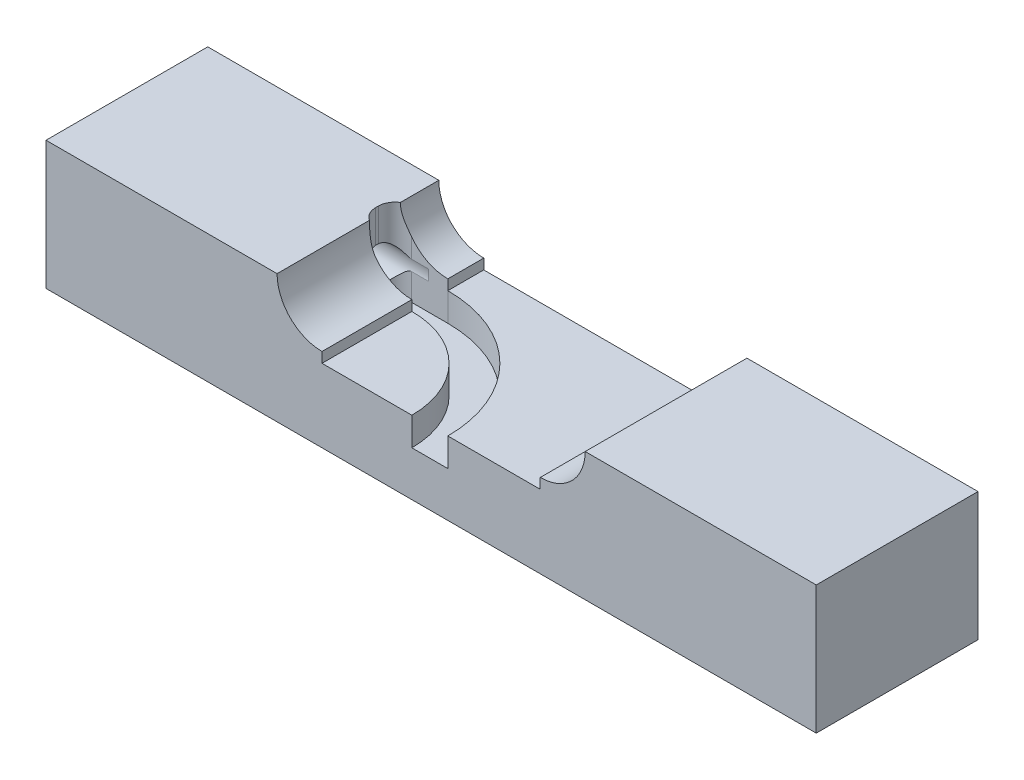
ISO-10303-21;
HEADER;
FILE_DESCRIPTION(('STEP AP214'),'2;1');
FILE_NAME('part.step','',(''),(''),'','','');
FILE_SCHEMA(('AUTOMOTIVE_DESIGN { 1 0 10303 214 1 1 1 1 }'));
ENDSEC;
DATA;
#1=APPLICATION_CONTEXT('core data for automotive mechanical design processes');
#2=APPLICATION_PROTOCOL_DEFINITION('international standard','automotive_design',2000,#1);
#3=PRODUCT_CONTEXT('',#1,'mechanical');
#4=PRODUCT('Part','Part','',(#3));
#5=PRODUCT_RELATED_PRODUCT_CATEGORY('part','',(#4));
#6=PRODUCT_DEFINITION_FORMATION('','',#4);
#7=PRODUCT_DEFINITION_CONTEXT('part definition',#1,'design');
#8=PRODUCT_DEFINITION('design','',#6,#7);
#9=PRODUCT_DEFINITION_SHAPE('','',#8);
#10=(LENGTH_UNIT() NAMED_UNIT(*) SI_UNIT(.MILLI.,.METRE.));
#11=(NAMED_UNIT(*) PLANE_ANGLE_UNIT() SI_UNIT($,.RADIAN.));
#12=(NAMED_UNIT(*) SI_UNIT($,.STERADIAN.) SOLID_ANGLE_UNIT());
#13=UNCERTAINTY_MEASURE_WITH_UNIT(LENGTH_MEASURE(1.E-05),#10,'distance_accuracy_value','');
#14=(GEOMETRIC_REPRESENTATION_CONTEXT(3) GLOBAL_UNCERTAINTY_ASSIGNED_CONTEXT((#13)) GLOBAL_UNIT_ASSIGNED_CONTEXT((#10,
#11,#12)) REPRESENTATION_CONTEXT('',''));
#15=CARTESIAN_POINT('',(0.,0.,0.));
#16=DIRECTION('',(0.,0.,1.));
#17=DIRECTION('',(1.,0.,0.));
#18=AXIS2_PLACEMENT_3D('',#15,#16,#17);
#19=CARTESIAN_POINT('',(-5.3975,6.35000000000001,4.0005));
#20=DIRECTION('',(0.,-1.,0.));
#21=DIRECTION('',(1.,0.,0.));
#22=AXIS2_PLACEMENT_3D('',#19,#20,#21);
#23=CYLINDRICAL_SURFACE('',#22,4.445);
#24=DIRECTION('',(0.,-1.,0.));
#25=VECTOR('',#24,1.);
#26=CARTESIAN_POINT('',(-5.3975,6.35000000000001,-0.444499999999999));
#27=LINE('',#26,#25);
#28=CARTESIAN_POINT('',(-5.3975,3.6195,-0.444499999999999));
#29=VERTEX_POINT('',#28);
#30=CARTESIAN_POINT('',(-5.3975,2.2225,-0.444499999999999));
#31=VERTEX_POINT('',#30);
#32=EDGE_CURVE('E514',#29,#31,#27,.T.);
#33=ORIENTED_EDGE('',*,*,#32,.F.);
#34=CARTESIAN_POINT('',(-5.3975,3.6195,4.0005));
#35=DIRECTION('',(0.,1.,0.));
#36=DIRECTION('',(-1.,0.,0.));
#37=AXIS2_PLACEMENT_3D('',#34,#35,#36);
#38=CIRCLE('',#37,4.445);
#39=CARTESIAN_POINT('',(-0.952499999999998,3.6195,4.0005));
#40=VERTEX_POINT('',#39);
#41=EDGE_CURVE('E238',#29,#40,#38,.F.);
#42=ORIENTED_EDGE('',*,*,#41,.T.);
#43=DIRECTION('',(0.,-1.,0.));
#44=VECTOR('',#43,1.);
#45=CARTESIAN_POINT('',(-0.952499999999998,6.35000000000001,4.0005));
#46=LINE('',#45,#44);
#47=CARTESIAN_POINT('',(-0.9525,2.2225,4.0005));
#48=VERTEX_POINT('',#47);
#49=EDGE_CURVE('E512',#40,#48,#46,.T.);
#50=ORIENTED_EDGE('',*,*,#49,.T.);
#51=CARTESIAN_POINT('',(-5.3975,2.2225,4.0005));
#52=DIRECTION('',(0.,-1.,0.));
#53=DIRECTION('',(-1.,0.,0.));
#54=AXIS2_PLACEMENT_3D('',#51,#52,#53);
#55=CIRCLE('',#54,4.445);
#56=EDGE_CURVE('E474',#31,#48,#55,.T.);
#57=ORIENTED_EDGE('',*,*,#56,.F.);
#58=EDGE_LOOP('',(#33,#42,#50,#57));
#59=FACE_BOUND('',#58,.T.);
#60=ADVANCED_FACE('F33',(#59),#23,.T.);
#61=CARTESIAN_POINT('',(-5.3975,6.35000000000001,4.0005));
#62=DIRECTION('',(0.,-1.,0.));
#63=DIRECTION('',(1.,0.,0.));
#64=AXIS2_PLACEMENT_3D('',#61,#62,#63);
#65=CYLINDRICAL_SURFACE('',#64,6.223);
#66=DIRECTION('',(0.,-1.,0.));
#67=VECTOR('',#66,1.);
#68=CARTESIAN_POINT('',(0.825500000000002,6.35000000000001,4.0005));
#69=LINE('',#68,#67);
#70=CARTESIAN_POINT('',(0.825500000000002,3.6195,4.0005));
#71=VERTEX_POINT('',#70);
#72=CARTESIAN_POINT('',(0.825500000000001,2.2225,4.0005));
#73=VERTEX_POINT('',#72);
#74=EDGE_CURVE('E510',#71,#73,#69,.T.);
#75=ORIENTED_EDGE('',*,*,#74,.F.);
#76=CARTESIAN_POINT('',(-5.3975,3.6195,4.0005));
#77=DIRECTION('',(0.,1.,0.));
#78=DIRECTION('',(-1.,0.,0.));
#79=AXIS2_PLACEMENT_3D('',#76,#77,#78);
#80=CIRCLE('',#79,6.223);
#81=CARTESIAN_POINT('',(-5.3975,3.6195,-2.2225));
#82=VERTEX_POINT('',#81);
#83=EDGE_CURVE('E11',#71,#82,#80,.T.);
#84=ORIENTED_EDGE('',*,*,#83,.T.);
#85=DIRECTION('',(0.,-1.,0.));
#86=VECTOR('',#85,1.);
#87=CARTESIAN_POINT('',(-5.3975,6.35000000000001,-2.2225));
#88=LINE('',#87,#86);
#89=CARTESIAN_POINT('',(-5.3975,2.2225,-2.2225));
#90=VERTEX_POINT('',#89);
#91=EDGE_CURVE('E507',#82,#90,#88,.T.);
#92=ORIENTED_EDGE('',*,*,#91,.T.);
#93=CARTESIAN_POINT('',(-5.3975,2.2225,4.0005));
#94=DIRECTION('',(0.,1.,0.));
#95=DIRECTION('',(-1.,0.,0.));
#96=AXIS2_PLACEMENT_3D('',#93,#94,#95);
#97=CIRCLE('',#96,6.223);
#98=EDGE_CURVE('E480',#73,#90,#97,.T.);
#99=ORIENTED_EDGE('',*,*,#98,.F.);
#100=EDGE_LOOP('',(#75,#84,#92,#99));
#101=FACE_BOUND('',#100,.T.);
#102=ADVANCED_FACE('F438',(#101),#65,.F.);
#103=CARTESIAN_POINT('',(-7.185501787807,6.35000000000001,-1.27));
#104=DIRECTION('',(0.,-1.,0.));
#105=DIRECTION('',(1.,0.,0.));
#106=AXIS2_PLACEMENT_3D('',#103,#104,#105);
#107=CYLINDRICAL_SURFACE('',#106,0.8255);
#108=CARTESIAN_POINT('',(-8.011001787807,4.73492278596648,-1.27));
#109=CARTESIAN_POINT('',(-8.01100429627433,4.73357241711197,-1.25029014509458));
#110=CARTESIAN_POINT('',(-8.01029539444525,4.7315868495481,-1.23063717050888));
#111=CARTESIAN_POINT('',(-8.00750366463077,4.72638863584287,-1.1916103895195));
#112=CARTESIAN_POINT('',(-8.00542208231534,4.72317710334283,-1.17223634626624));
#113=CARTESIAN_POINT('',(-7.99724078712033,4.71183403137967,-1.1150847282786));
#114=CARTESIAN_POINT('',(-7.98920254331216,4.70196706516695,-1.07790444900373));
#115=CARTESIAN_POINT('',(-7.96865089912104,4.6782771001286,-1.00634509019563));
#116=CARTESIAN_POINT('',(-7.95615224037332,4.66446716250181,-0.971957235920432));
#117=CARTESIAN_POINT('',(-7.9274228368657,4.6336009927113,-0.906281129604926));
#118=CARTESIAN_POINT('',(-7.91118401366909,4.61653774762032,-0.874999799790443));
#119=CARTESIAN_POINT('',(-7.86779469186822,4.57173797393175,-0.802652492701029));
#120=CARTESIAN_POINT('',(-7.83900342266407,4.54262980425267,-0.763422913972083));
#121=CARTESIAN_POINT('',(-7.77674075347587,4.48094093007589,-0.691947247935397));
#122=CARTESIAN_POINT('',(-7.74325672152947,4.44835091137511,-0.659720629005867));
#123=CARTESIAN_POINT('',(-7.68549641210212,4.39350415672571,-0.612508190858164));
#124=CARTESIAN_POINT('',(-7.66229787318174,4.37179785058272,-0.59551369522539));
#125=CARTESIAN_POINT('',(-7.61448547550875,4.3279965408954,-0.564137071246268));
#126=CARTESIAN_POINT('',(-7.58987034036484,4.30590119966366,-0.549757348977014));
#127=CARTESIAN_POINT('',(-7.5391979441492,4.26186143072464,-0.523566511920037));
#128=CARTESIAN_POINT('',(-7.51314091908369,4.23991697897719,-0.511754978326231));
#129=CARTESIAN_POINT('',(-7.45930090683406,4.19697767104918,-0.49069078894692));
#130=CARTESIAN_POINT('',(-7.43152094017426,4.17598125863222,-0.481433801821091));
#131=CARTESIAN_POINT('',(-7.38507805255708,4.14458869235577,-0.468787600104508));
#132=CARTESIAN_POINT('',(-7.36724443639278,4.1333267173993,-0.464536104079745));
#133=CARTESIAN_POINT('',(-7.33051433309719,4.11264268655697,-0.457121523458437));
#134=CARTESIAN_POINT('',(-7.31162952225981,4.10320420318576,-0.453948504558346));
#135=CARTESIAN_POINT('',(-7.27532870698995,4.0886365559417,-0.449232824786402));
#136=CARTESIAN_POINT('',(-7.25812456627775,4.08307084537264,-0.447515845216));
#137=CARTESIAN_POINT('',(-7.22253940981336,4.07518967160813,-0.445129890882553));
#138=CARTESIAN_POINT('',(-7.20414052057299,4.07295106593286,-0.444485657734038));
#139=CARTESIAN_POINT('',(-7.18550178780691,4.07304640275076,-0.444499999999983));
#140=B_SPLINE_CURVE_WITH_KNOTS('',3,(#108,#109,#110,#111,#112,#113,#114,#115,#116,#117,#118,
#119,#120,#121,#122,#123,#124,#125,#126,#127,#128,#129,#130,#131,#132,#133,#134,#135,#136,#137,
#138,#139),.UNSPECIFIED.,.F.,.F.,(4,2,2,2,2,2,2,2,2,2,2,2,2,2,2,4),(0.,0.0592208734033163,
0.118388079302926,0.235617427271276,0.352462867708095,0.469563091185964,0.638747490064824,
0.808396372935695,0.916372990808518,1.02444846989651,1.13250631138936,1.24037979455625,
1.30484733652596,1.3687038383429,1.422871996447,1.47827300256446),.UNSPECIFIED.);
#141=CARTESIAN_POINT('',(-8.011001787807,4.73492278596648,-1.27));
#142=VERTEX_POINT('',#141);
#143=CARTESIAN_POINT('',(-7.185501787807,4.07304640275054,-0.444499999999998));
#144=VERTEX_POINT('',#143);
#145=EDGE_CURVE('E277',#142,#144,#140,.T.);
#146=ORIENTED_EDGE('',*,*,#145,.F.);
#147=DIRECTION('',(0.,-1.,0.));
#148=VECTOR('',#147,1.);
#149=CARTESIAN_POINT('',(-8.011001787807,6.35000000000001,-1.27));
#150=LINE('',#149,#148);
#151=CARTESIAN_POINT('',(-8.011001787807,6.35000000000001,-1.27));
#152=VERTEX_POINT('',#151);
#153=EDGE_CURVE('E498',#152,#142,#150,.T.);
#154=ORIENTED_EDGE('',*,*,#153,.F.);
#155=CARTESIAN_POINT('',(-7.185501787807,6.35000000000001,-1.27));
#156=DIRECTION('',(0.,1.,0.));
#157=DIRECTION('',(-1.,0.,0.));
#158=AXIS2_PLACEMENT_3D('',#155,#156,#157);
#159=CIRCLE('',#158,0.8255);
#160=CARTESIAN_POINT('',(-7.62,6.35000000000001,-0.568101464881787));
#161=VERTEX_POINT('',#160);
#162=EDGE_CURVE('E420',#152,#161,#159,.T.);
#163=ORIENTED_EDGE('',*,*,#162,.T.);
#164=CARTESIAN_POINT('',(-7.62,6.35,-0.568101464881786));
#165=CARTESIAN_POINT('',(-7.62000778683286,6.2942317556962,-0.568155959783248));
#166=CARTESIAN_POINT('',(-7.61790128625976,6.23848572489353,-0.56680246207239));
#167=CARTESIAN_POINT('',(-7.60953120592001,6.12749745380806,-0.561698173172178));
#168=CARTESIAN_POINT('',(-7.60327381938292,6.07225458708492,-0.557950953785573));
#169=CARTESIAN_POINT('',(-7.58686318579122,5.96381981117578,-0.548584105980528));
#170=CARTESIAN_POINT('',(-7.57680244490593,5.91060990606571,-0.543009325464433));
#171=CARTESIAN_POINT('',(-7.55286990497287,5.80519467439149,-0.530626907587932));
#172=CARTESIAN_POINT('',(-7.53899597879069,5.75298992598489,-0.523818582835912));
#173=CARTESIAN_POINT('',(-7.48715467803041,5.58310923473549,-0.500566361407703));
#174=CARTESIAN_POINT('',(-7.44119633574332,5.46786108536967,-0.483023652041814));
#175=CARTESIAN_POINT('',(-7.35734480156279,5.29996272703191,-0.462051787300172));
#176=CARTESIAN_POINT('',(-7.32638070957503,5.24410241334636,-0.4559064481468));
#177=CARTESIAN_POINT('',(-7.25956480274227,5.13495873628409,-0.44714489016481));
#178=CARTESIAN_POINT('',(-7.22370338267869,5.08168072299766,-0.444535719569762));
#179=CARTESIAN_POINT('',(-7.18550178780702,5.02994096465387,-0.444499999999879));
#180=B_SPLINE_CURVE_WITH_KNOTS('',3,(#164,#165,#166,#167,#168,#169,#170,#171,#172,#173,#174,
#175,#176,#177,#178,#179),.UNSPECIFIED.,.F.,.F.,(4,2,2,2,2,2,2,4),(0.,0.167212406880916,
0.334175887973908,0.497315525017376,0.66054635268264,1.03437256540905,1.22658474939379,
1.41917948689991),.UNSPECIFIED.);
#181=CARTESIAN_POINT('',(-7.185501787807,5.02994096465386,-0.444499999999997));
#182=VERTEX_POINT('',#181);
#183=EDGE_CURVE('E312',#161,#182,#180,.T.);
#184=ORIENTED_EDGE('',*,*,#183,.T.);
#185=DIRECTION('',(0.,-1.,0.));
#186=VECTOR('',#185,1.);
#187=CARTESIAN_POINT('',(-7.185501787807,6.35000000000001,-0.444499999999998));
#188=LINE('',#187,#186);
#189=EDGE_CURVE('E356',#182,#144,#188,.T.);
#190=ORIENTED_EDGE('',*,*,#189,.T.);
#191=EDGE_LOOP('',(#146,#154,#163,#184,#190));
#192=FACE_BOUND('',#191,.T.);
#193=ADVANCED_FACE('F306',(#192),#107,.F.);
#194=CARTESIAN_POINT('',(-7.185501787807,6.35000000000001,-1.397));
#195=DIRECTION('',(0.,-1.,0.));
#196=DIRECTION('',(1.,0.,0.));
#197=AXIS2_PLACEMENT_3D('',#194,#195,#196);
#198=CYLINDRICAL_SURFACE('',#197,0.8255);
#199=CARTESIAN_POINT('',(-7.185501787807,4.07304640275054,-2.2225));
#200=CARTESIAN_POINT('',(-7.20137508547815,4.07297394175186,-2.22251120398897));
#201=CARTESIAN_POINT('',(-7.21711939214587,4.07459478886162,-2.22204327502919));
#202=CARTESIAN_POINT('',(-7.2477696033208,4.08044371482261,-2.2202852222224));
#203=CARTESIAN_POINT('',(-7.26268586400436,4.08462040633677,-2.21901128707235));
#204=CARTESIAN_POINT('',(-7.30067449216134,4.09800302989339,-2.21477088805847));
#205=CARTESIAN_POINT('',(-7.32312000912311,4.10872220342683,-2.2112453389613));
#206=CARTESIAN_POINT('',(-7.36653750715519,4.13272684979304,-2.20271167506));
#207=CARTESIAN_POINT('',(-7.3874879675704,4.14604226683695,-2.19768585781522));
#208=CARTESIAN_POINT('',(-7.43152115379635,4.1762468036903,-2.18537177923953));
#209=CARTESIAN_POINT('',(-7.45438012749811,4.19336216869569,-2.17784639474665));
#210=CARTESIAN_POINT('',(-7.49887130005525,4.22834205118259,-2.16107704541581));
#211=CARTESIAN_POINT('',(-7.52050227979302,4.24620728353911,-2.15183141039794));
#212=CARTESIAN_POINT('',(-7.58382167776042,4.30006795457015,-2.1215580119188));
#213=CARTESIAN_POINT('',(-7.62403118857022,4.33640012100731,-2.09796644361478));
#214=CARTESIAN_POINT('',(-7.70721980111109,4.41367423725288,-2.03908518632841));
#215=CARTESIAN_POINT('',(-7.74952463370818,4.45436187449298,-2.00249442287428));
#216=CARTESIAN_POINT('',(-7.82761408390082,4.5311157222801,-1.91890928864679));
#217=CARTESIAN_POINT('',(-7.86341690622267,4.56719474945362,-1.87194480745443));
#218=CARTESIAN_POINT('',(-7.91321811193707,4.61865241349362,-1.78842124970731));
#219=CARTESIAN_POINT('',(-7.9302156931707,4.63654557915209,-1.75519092097903));
#220=CARTESIAN_POINT('',(-7.95995007247512,4.66861712764044,-1.68529749329158));
#221=CARTESIAN_POINT('',(-7.97269992469205,4.68280686220562,-1.64864536320193));
#222=CARTESIAN_POINT('',(-7.99194663736509,4.70531229913797,-1.57677460511443));
#223=CARTESIAN_POINT('',(-7.99898418528981,4.71410812441888,-1.5418557612454));
#224=CARTESIAN_POINT('',(-8.00613523629889,4.72426421899093,-1.4883237014849));
#225=CARTESIAN_POINT('',(-8.00795173278667,4.7271489970963,-1.47020798260539));
#226=CARTESIAN_POINT('',(-8.01038650538116,4.73184835030236,-1.43374432821254));
#227=CARTESIAN_POINT('',(-8.01100382971607,4.73366207452358,-1.4153962198688));
#228=CARTESIAN_POINT('',(-8.011001787807,4.73492278596648,-1.39699999999999));
#229=B_SPLINE_CURVE_WITH_KNOTS('',3,(#199,#200,#201,#202,#203,#204,#205,#206,#207,#208,#209,
#210,#211,#212,#213,#214,#215,#216,#217,#218,#219,#220,#221,#222,#223,#224,#225,#226,#227,#228),
.UNSPECIFIED.,.F.,.F.,(4,2,2,2,2,2,2,2,2,2,2,2,2,2,4),(0.,0.04732715697656,0.0937326751515071,
0.168682838697682,0.244554903366197,0.333027977853881,0.421587402788971,0.598343701639881,
0.804872067708256,1.01081295493491,1.13455519808649,1.25791357033494,1.36744539636876,
1.4226823487975,1.47796312439866),.UNSPECIFIED.);
#230=CARTESIAN_POINT('',(-7.185501787807,4.07304640275054,-2.2225));
#231=VERTEX_POINT('',#230);
#232=CARTESIAN_POINT('',(-8.011001787807,4.73492278596648,-1.39699999999999));
#233=VERTEX_POINT('',#232);
#234=EDGE_CURVE('E56',#231,#233,#229,.T.);
#235=ORIENTED_EDGE('',*,*,#234,.F.);
#236=DIRECTION('',(0.,-1.,0.));
#237=VECTOR('',#236,1.);
#238=CARTESIAN_POINT('',(-7.185501787807,6.35000000000001,-2.2225));
#239=LINE('',#238,#237);
#240=CARTESIAN_POINT('',(-7.185501787807,5.02994096465386,-2.2225));
#241=VERTEX_POINT('',#240);
#242=EDGE_CURVE('E458',#241,#231,#239,.T.);
#243=ORIENTED_EDGE('',*,*,#242,.F.);
#244=CARTESIAN_POINT('',(-7.185501787807,5.02994096465386,-2.2225));
#245=CARTESIAN_POINT('',(-7.21703845386341,5.07264822573414,-2.22248266969745));
#246=CARTESIAN_POINT('',(-7.24700225187703,5.11644472148956,-2.22069499492103));
#247=CARTESIAN_POINT('',(-7.3036130606261,5.20587181564332,-2.21450596986682));
#248=CARTESIAN_POINT('',(-7.33026496222516,5.25149957463684,-2.21010853040976));
#249=CARTESIAN_POINT('',(-7.38026742391301,5.34454434594894,-2.19960220662164));
#250=CARTESIAN_POINT('',(-7.40360552743857,5.39196730264591,-2.19348710931963));
#251=CARTESIAN_POINT('',(-7.4468126528054,5.48825018654595,-2.18037447842579));
#252=CARTESIAN_POINT('',(-7.46668024871866,5.53711069480741,-2.17337658414319));
#253=CARTESIAN_POINT('',(-7.52324212158068,5.69178790539033,-2.15138468593938));
#254=CARTESIAN_POINT('',(-7.55378413767857,5.79996025969735,-2.1362343601357));
#255=CARTESIAN_POINT('',(-7.58710517271751,5.96493122300364,-2.11833029820054));
#256=CARTESIAN_POINT('',(-7.59612609653876,6.02029111268776,-2.11316986943691));
#257=CARTESIAN_POINT('',(-7.60996216444688,6.13168939518391,-2.10506135143626));
#258=CARTESIAN_POINT('',(-7.61478025447561,6.18772728477847,-2.10211171276854));
#259=CARTESIAN_POINT('',(-7.6183099841181,6.26155203731703,-2.0999420745135));
#260=CARTESIAN_POINT('',(-7.61894359432549,6.27923251768059,-2.09955142950313));
#261=CARTESIAN_POINT('',(-7.61978852499174,6.31460792446406,-2.0990297089342));
#262=CARTESIAN_POINT('',(-7.61999983266505,6.33230285130513,-2.09889864123455));
#263=CARTESIAN_POINT('',(-7.62,6.35,-2.09889853511821));
#264=B_SPLINE_CURVE_WITH_KNOTS('',3,(#244,#245,#246,#247,#248,#249,#250,#251,#252,#253,#254,
#255,#256,#257,#258,#259,#260,#261,#262,#263),.UNSPECIFIED.,.F.,.F.,(4,2,2,2,2,2,2,2,2,4),(0.,
0.159121599783614,0.31800535042175,0.47747137148533,0.637002759051539,0.975647839938983,
1.1444798313697,1.31319338608705,1.36627705881637,1.41936233867072),.UNSPECIFIED.);
#265=CARTESIAN_POINT('',(-7.62,6.35000000000001,-2.09889853511821));
#266=VERTEX_POINT('',#265);
#267=EDGE_CURVE('E332',#241,#266,#264,.T.);
#268=ORIENTED_EDGE('',*,*,#267,.T.);
#269=CARTESIAN_POINT('',(-7.185501787807,6.35000000000001,-1.397));
#270=DIRECTION('',(0.,1.,0.));
#271=DIRECTION('',(-1.,0.,0.));
#272=AXIS2_PLACEMENT_3D('',#269,#270,#271);
#273=CIRCLE('',#272,0.8255);
#274=CARTESIAN_POINT('',(-8.011001787807,6.35000000000001,-1.39699999999999));
#275=VERTEX_POINT('',#274);
#276=EDGE_CURVE('E493',#266,#275,#273,.T.);
#277=ORIENTED_EDGE('',*,*,#276,.T.);
#278=DIRECTION('',(0.,-1.,0.));
#279=VECTOR('',#278,1.);
#280=CARTESIAN_POINT('',(-8.011001787807,6.35000000000001,-1.39699999999999));
#281=LINE('',#280,#279);
#282=EDGE_CURVE('E502',#275,#233,#281,.T.);
#283=ORIENTED_EDGE('',*,*,#282,.T.);
#284=EDGE_LOOP('',(#235,#243,#268,#277,#283));
#285=FACE_BOUND('',#284,.T.);
#286=ADVANCED_FACE('F454',(#285),#198,.F.);
#287=CARTESIAN_POINT('',(-8.011001787807,6.35000000000001,-1.27));
#288=DIRECTION('',(1.,0.,0.));
#289=DIRECTION('',(0.,1.,0.));
#290=AXIS2_PLACEMENT_3D('',#287,#288,#289);
#291=PLANE('',#290);
#292=CARTESIAN_POINT('',(-8.011001787807,3.81,-1.3335));
#293=DIRECTION('',(1.,0.,0.));
#294=DIRECTION('',(0.,1.,0.));
#295=AXIS2_PLACEMENT_3D('',#292,#293,#294);
#296=CIRCLE('',#295,0.9271);
#297=CARTESIAN_POINT('',(-8.011001787807,2.88507721403352,-1.27));
#298=VERTEX_POINT('',#297);
#299=CARTESIAN_POINT('',(-8.011001787807,2.88507721403352,-1.39699999999999));
#300=VERTEX_POINT('',#299);
#301=EDGE_CURVE('E548',#298,#300,#296,.T.);
#302=ORIENTED_EDGE('',*,*,#301,.F.);
#303=CARTESIAN_POINT('',(-8.011001787807,2.2225,-1.27));
#304=VERTEX_POINT('',#303);
#305=EDGE_CURVE('E497',#298,#304,#150,.T.);
#306=ORIENTED_EDGE('',*,*,#305,.T.);
#307=DIRECTION('',(0.,0.,1.));
#308=VECTOR('',#307,1.);
#309=CARTESIAN_POINT('',(-8.011001787807,2.2225,-1.27));
#310=LINE('',#309,#308);
#311=CARTESIAN_POINT('',(-8.011001787807,2.2225,-1.39699999999999));
#312=VERTEX_POINT('',#311);
#313=EDGE_CURVE('E489',#312,#304,#310,.T.);
#314=ORIENTED_EDGE('',*,*,#313,.F.);
#315=EDGE_CURVE('E501',#300,#312,#281,.T.);
#316=ORIENTED_EDGE('',*,*,#315,.F.);
#317=EDGE_LOOP('',(#302,#306,#314,#316));
#318=FACE_BOUND('',#317,.T.);
#319=ADVANCED_FACE('F552',(#318),#291,.T.);
#320=CARTESIAN_POINT('',(0.,6.35,0.));
#321=DIRECTION('',(0.,-1.,0.));
#322=DIRECTION('',(0.,0.,-1.));
#323=AXIS2_PLACEMENT_3D('',#320,#321,#322);
#324=PLANE('',#323);
#325=ORIENTED_EDGE('',*,*,#162,.F.);
#326=DIRECTION('',(0.,0.,1.));
#327=VECTOR('',#326,1.);
#328=CARTESIAN_POINT('',(-8.011001787807,6.35000000000001,-1.27));
#329=LINE('',#328,#327);
#330=EDGE_CURVE('E495',#275,#152,#329,.T.);
#331=ORIENTED_EDGE('',*,*,#330,.F.);
#332=ORIENTED_EDGE('',*,*,#276,.F.);
#333=DIRECTION('',(0.,0.,-1.));
#334=VECTOR('',#333,1.);
#335=CARTESIAN_POINT('',(-7.62,6.35,21.3995));
#336=LINE('',#335,#334);
#337=CARTESIAN_POINT('',(-7.62,6.35,-4.0005));
#338=VERTEX_POINT('',#337);
#339=EDGE_CURVE('E409',#266,#338,#336,.T.);
#340=ORIENTED_EDGE('',*,*,#339,.T.);
#341=DIRECTION('',(-1.,0.,0.));
#342=VECTOR('',#341,1.);
#343=CARTESIAN_POINT('',(-19.05,6.35,-4.0005));
#344=LINE('',#343,#342);
#345=CARTESIAN_POINT('',(-19.05,6.35,-4.0005));
#346=VERTEX_POINT('',#345);
#347=EDGE_CURVE('E378',#338,#346,#344,.T.);
#348=ORIENTED_EDGE('',*,*,#347,.T.);
#349=DIRECTION('',(0.,0.,1.));
#350=VECTOR('',#349,1.);
#351=CARTESIAN_POINT('',(-19.05,6.35,4.0005));
#352=LINE('',#351,#350);
#353=CARTESIAN_POINT('',(-19.05,6.35,4.0005));
#354=VERTEX_POINT('',#353);
#355=EDGE_CURVE('E383',#346,#354,#352,.T.);
#356=ORIENTED_EDGE('',*,*,#355,.T.);
#357=DIRECTION('',(1.,0.,0.));
#358=VECTOR('',#357,1.);
#359=CARTESIAN_POINT('',(-19.05,6.35,4.0005));
#360=LINE('',#359,#358);
#361=CARTESIAN_POINT('',(-7.62,6.35,4.0005));
#362=VERTEX_POINT('',#361);
#363=EDGE_CURVE('E386',#354,#362,#360,.T.);
#364=ORIENTED_EDGE('',*,*,#363,.T.);
#365=EDGE_CURVE('E338',#362,#161,#336,.T.);
#366=ORIENTED_EDGE('',*,*,#365,.T.);
#367=EDGE_LOOP('',(#325,#331,#332,#340,#348,#356,#364,#366));
#368=FACE_BOUND('',#367,.T.);
#369=ADVANCED_FACE('F418',(#368),#324,.F.);
#370=CARTESIAN_POINT('',(-19.05,6.35,4.0005));
#371=DIRECTION('',(0.,0.,-1.));
#372=DIRECTION('',(-1.,0.,0.));
#373=AXIS2_PLACEMENT_3D('',#370,#371,#372);
#374=PLANE('',#373);
#375=DIRECTION('',(1.,0.,0.));
#376=VECTOR('',#375,1.);
#377=CARTESIAN_POINT('',(5.3975,3.6195,4.0005));
#378=LINE('',#377,#376);
#379=CARTESIAN_POINT('',(-5.3975,3.6195,4.0005));
#380=VERTEX_POINT('',#379);
#381=EDGE_CURVE('E218',#380,#40,#378,.T.);
#382=ORIENTED_EDGE('',*,*,#381,.F.);
#383=DIRECTION('',(0.,1.,0.));
#384=VECTOR('',#383,1.);
#385=CARTESIAN_POINT('',(-5.3975,3.6195,4.0005));
#386=LINE('',#385,#384);
#387=CARTESIAN_POINT('',(-5.3975,4.1275,4.0005));
#388=VERTEX_POINT('',#387);
#389=EDGE_CURVE('E239',#380,#388,#386,.T.);
#390=ORIENTED_EDGE('',*,*,#389,.T.);
#391=CARTESIAN_POINT('',(-5.3975,6.35,4.0005));
#392=DIRECTION('',(0.,0.,-1.));
#393=DIRECTION('',(-1.,0.,0.));
#394=AXIS2_PLACEMENT_3D('',#391,#392,#393);
#395=CIRCLE('',#394,2.2225);
#396=EDGE_CURVE('E361',#388,#362,#395,.T.);
#397=ORIENTED_EDGE('',*,*,#396,.T.);
#398=ORIENTED_EDGE('',*,*,#363,.F.);
#399=DIRECTION('',(0.,-1.,0.));
#400=VECTOR('',#399,1.);
#401=CARTESIAN_POINT('',(-19.05,6.35,4.0005));
#402=LINE('',#401,#400);
#403=CARTESIAN_POINT('',(-19.05,0.,4.0005));
#404=VERTEX_POINT('',#403);
#405=EDGE_CURVE('E399',#354,#404,#402,.T.);
#406=ORIENTED_EDGE('',*,*,#405,.T.);
#407=DIRECTION('',(1.,0.,0.));
#408=VECTOR('',#407,1.);
#409=CARTESIAN_POINT('',(-19.05,0.,4.0005));
#410=LINE('',#409,#408);
#411=CARTESIAN_POINT('',(19.05,0.,4.0005));
#412=VERTEX_POINT('',#411);
#413=EDGE_CURVE('E379',#404,#412,#410,.T.);
#414=ORIENTED_EDGE('',*,*,#413,.T.);
#415=DIRECTION('',(0.,-1.,0.));
#416=VECTOR('',#415,1.);
#417=CARTESIAN_POINT('',(19.05,6.35,4.0005));
#418=LINE('',#417,#416);
#419=CARTESIAN_POINT('',(19.05,6.35,4.0005));
#420=VERTEX_POINT('',#419);
#421=EDGE_CURVE('E389',#420,#412,#418,.T.);
#422=ORIENTED_EDGE('',*,*,#421,.F.);
#423=CARTESIAN_POINT('',(7.62,6.35,4.0005));
#424=VERTEX_POINT('',#423);
#425=EDGE_CURVE('E385',#424,#420,#360,.T.);
#426=ORIENTED_EDGE('',*,*,#425,.F.);
#427=CARTESIAN_POINT('',(5.3975,6.35,4.0005));
#428=DIRECTION('',(0.,0.,-1.));
#429=DIRECTION('',(-1.,0.,0.));
#430=AXIS2_PLACEMENT_3D('',#427,#428,#429);
#431=CIRCLE('',#430,2.2225);
#432=CARTESIAN_POINT('',(5.3975,4.1275,4.0005));
#433=VERTEX_POINT('',#432);
#434=EDGE_CURVE('E362',#424,#433,#431,.T.);
#435=ORIENTED_EDGE('',*,*,#434,.T.);
#436=DIRECTION('',(0.,1.,0.));
#437=VECTOR('',#436,1.);
#438=CARTESIAN_POINT('',(5.3975,3.6195,4.0005));
#439=LINE('',#438,#437);
#440=CARTESIAN_POINT('',(5.3975,3.6195,4.0005));
#441=VERTEX_POINT('',#440);
#442=EDGE_CURVE('E236',#441,#433,#439,.T.);
#443=ORIENTED_EDGE('',*,*,#442,.F.);
#444=EDGE_CURVE('E227',#71,#441,#378,.T.);
#445=ORIENTED_EDGE('',*,*,#444,.F.);
#446=ORIENTED_EDGE('',*,*,#74,.T.);
#447=DIRECTION('',(1.,0.,0.));
#448=VECTOR('',#447,1.);
#449=CARTESIAN_POINT('',(0.8255,2.2225,4.0005));
#450=LINE('',#449,#448);
#451=EDGE_CURVE('E477',#48,#73,#450,.T.);
#452=ORIENTED_EDGE('',*,*,#451,.F.);
#453=ORIENTED_EDGE('',*,*,#49,.F.);
#454=EDGE_LOOP('',(#382,#390,#397,#398,#406,#414,#422,#426,#435,#443,#445,#446,#452,#453));
#455=FACE_BOUND('',#454,.T.);
#456=ADVANCED_FACE('F326',(#455),#374,.F.);
#457=CARTESIAN_POINT('',(-5.3975,6.35,21.3995));
#458=DIRECTION('',(0.,0.,-1.));
#459=DIRECTION('',(-1.,0.,0.));
#460=AXIS2_PLACEMENT_3D('',#457,#458,#459);
#461=CYLINDRICAL_SURFACE('',#460,2.2225);
#462=ORIENTED_EDGE('',*,*,#183,.F.);
#463=ORIENTED_EDGE('',*,*,#365,.F.);
#464=ORIENTED_EDGE('',*,*,#396,.F.);
#465=DIRECTION('',(0.,0.,-1.));
#466=VECTOR('',#465,1.);
#467=CARTESIAN_POINT('',(-5.3975,4.1275,21.3995));
#468=LINE('',#467,#466);
#469=CARTESIAN_POINT('',(-5.3975,4.1275,-0.444499999999999));
#470=VERTEX_POINT('',#469);
#471=EDGE_CURVE('E359',#388,#470,#468,.T.);
#472=ORIENTED_EDGE('',*,*,#471,.T.);
#473=CARTESIAN_POINT('',(-5.3975,6.35,-0.444499999999997));
#474=DIRECTION('',(0.,0.,-1.));
#475=DIRECTION('',(-1.,0.,0.));
#476=AXIS2_PLACEMENT_3D('',#473,#474,#475);
#477=CIRCLE('',#476,2.2225);
#478=EDGE_CURVE('E319',#182,#470,#477,.F.);
#479=ORIENTED_EDGE('',*,*,#478,.F.);
#480=EDGE_LOOP('',(#462,#463,#464,#472,#479));
#481=FACE_BOUND('',#480,.T.);
#482=ADVANCED_FACE('F321',(#481),#461,.F.);
#483=CARTESIAN_POINT('',(-5.3975,6.35,-2.2225));
#484=DIRECTION('',(0.,0.,1.));
#485=DIRECTION('',(1.,0.,0.));
#486=AXIS2_PLACEMENT_3D('',#483,#484,#485);
#487=CIRCLE('',#486,2.2225);
#488=CARTESIAN_POINT('',(-5.3975,4.1275,-2.2225));
#489=VERTEX_POINT('',#488);
#490=EDGE_CURVE('E337',#489,#241,#487,.F.);
#491=ORIENTED_EDGE('',*,*,#490,.F.);
#492=CARTESIAN_POINT('',(-5.3975,4.1275,-4.0005));
#493=VERTEX_POINT('',#492);
#494=EDGE_CURVE('E363',#489,#493,#468,.T.);
#495=ORIENTED_EDGE('',*,*,#494,.T.);
#496=CARTESIAN_POINT('',(-5.3975,6.35,-4.0005));
#497=DIRECTION('',(0.,0.,-1.));
#498=DIRECTION('',(-1.,0.,0.));
#499=AXIS2_PLACEMENT_3D('',#496,#497,#498);
#500=CIRCLE('',#499,2.2225);
#501=EDGE_CURVE('E517',#493,#338,#500,.T.);
#502=ORIENTED_EDGE('',*,*,#501,.T.);
#503=ORIENTED_EDGE('',*,*,#339,.F.);
#504=ORIENTED_EDGE('',*,*,#267,.F.);
#505=EDGE_LOOP('',(#491,#495,#502,#503,#504));
#506=FACE_BOUND('',#505,.T.);
#507=ADVANCED_FACE('F325',(#506),#461,.F.);
#508=CARTESIAN_POINT('',(19.05,6.35,4.0005));
#509=DIRECTION('',(-1.,0.,0.));
#510=DIRECTION('',(0.,0.,1.));
#511=AXIS2_PLACEMENT_3D('',#508,#509,#510);
#512=PLANE('',#511);
#513=DIRECTION('',(0.,0.,-1.));
#514=VECTOR('',#513,1.);
#515=CARTESIAN_POINT('',(19.05,0.,4.0005));
#516=LINE('',#515,#514);
#517=CARTESIAN_POINT('',(19.05,0.,-4.0005));
#518=VERTEX_POINT('',#517);
#519=EDGE_CURVE('E374',#412,#518,#516,.T.);
#520=ORIENTED_EDGE('',*,*,#519,.T.);
#521=DIRECTION('',(0.,-1.,0.));
#522=VECTOR('',#521,1.);
#523=CARTESIAN_POINT('',(19.05,6.35,-4.0005));
#524=LINE('',#523,#522);
#525=CARTESIAN_POINT('',(19.05,6.35,-4.0005));
#526=VERTEX_POINT('',#525);
#527=EDGE_CURVE('E405',#526,#518,#524,.T.);
#528=ORIENTED_EDGE('',*,*,#527,.F.);
#529=DIRECTION('',(0.,0.,-1.));
#530=VECTOR('',#529,1.);
#531=CARTESIAN_POINT('',(19.05,6.35,4.0005));
#532=LINE('',#531,#530);
#533=EDGE_CURVE('E375',#420,#526,#532,.T.);
#534=ORIENTED_EDGE('',*,*,#533,.F.);
#535=ORIENTED_EDGE('',*,*,#421,.T.);
#536=EDGE_LOOP('',(#520,#528,#534,#535));
#537=FACE_BOUND('',#536,.T.);
#538=ADVANCED_FACE('F35',(#537),#512,.F.);
#539=CARTESIAN_POINT('',(-19.05,6.35,-4.0005));
#540=DIRECTION('',(0.,0.,1.));
#541=DIRECTION('',(1.,0.,0.));
#542=AXIS2_PLACEMENT_3D('',#539,#540,#541);
#543=PLANE('',#542);
#544=DIRECTION('',(-1.,0.,0.));
#545=VECTOR('',#544,1.);
#546=CARTESIAN_POINT('',(5.3975,3.6195,-4.0005));
#547=LINE('',#546,#545);
#548=CARTESIAN_POINT('',(5.3975,3.6195,-4.0005));
#549=VERTEX_POINT('',#548);
#550=CARTESIAN_POINT('',(-5.3975,3.6195,-4.0005));
#551=VERTEX_POINT('',#550);
#552=EDGE_CURVE('E224',#549,#551,#547,.T.);
#553=ORIENTED_EDGE('',*,*,#552,.F.);
#554=DIRECTION('',(0.,1.,0.));
#555=VECTOR('',#554,1.);
#556=CARTESIAN_POINT('',(5.3975,3.6195,-4.0005));
#557=LINE('',#556,#555);
#558=CARTESIAN_POINT('',(5.3975,4.1275,-4.0005));
#559=VERTEX_POINT('',#558);
#560=EDGE_CURVE('E206',#549,#559,#557,.T.);
#561=ORIENTED_EDGE('',*,*,#560,.T.);
#562=CARTESIAN_POINT('',(5.3975,6.35,-4.0005));
#563=DIRECTION('',(0.,0.,-1.));
#564=DIRECTION('',(-1.,0.,0.));
#565=AXIS2_PLACEMENT_3D('',#562,#563,#564);
#566=CIRCLE('',#565,2.2225);
#567=CARTESIAN_POINT('',(7.62,6.35,-4.0005));
#568=VERTEX_POINT('',#567);
#569=EDGE_CURVE('E370',#568,#559,#566,.T.);
#570=ORIENTED_EDGE('',*,*,#569,.F.);
#571=EDGE_CURVE('E380',#526,#568,#344,.T.);
#572=ORIENTED_EDGE('',*,*,#571,.F.);
#573=ORIENTED_EDGE('',*,*,#527,.T.);
#574=DIRECTION('',(-1.,0.,0.));
#575=VECTOR('',#574,1.);
#576=CARTESIAN_POINT('',(-19.05,0.,-4.0005));
#577=LINE('',#576,#575);
#578=CARTESIAN_POINT('',(-19.05,0.,-4.0005));
#579=VERTEX_POINT('',#578);
#580=EDGE_CURVE('E392',#518,#579,#577,.T.);
#581=ORIENTED_EDGE('',*,*,#580,.T.);
#582=DIRECTION('',(0.,-1.,0.));
#583=VECTOR('',#582,1.);
#584=CARTESIAN_POINT('',(-19.05,6.35,-4.0005));
#585=LINE('',#584,#583);
#586=EDGE_CURVE('E402',#346,#579,#585,.T.);
#587=ORIENTED_EDGE('',*,*,#586,.F.);
#588=ORIENTED_EDGE('',*,*,#347,.F.);
#589=ORIENTED_EDGE('',*,*,#501,.F.);
#590=DIRECTION('',(0.,1.,0.));
#591=VECTOR('',#590,1.);
#592=CARTESIAN_POINT('',(-5.3975,3.6195,-4.0005));
#593=LINE('',#592,#591);
#594=EDGE_CURVE('E217',#551,#493,#593,.T.);
#595=ORIENTED_EDGE('',*,*,#594,.F.);
#596=EDGE_LOOP('',(#553,#561,#570,#572,#573,#581,#587,#588,#589,#595));
#597=FACE_BOUND('',#596,.T.);
#598=ADVANCED_FACE('F229',(#597),#543,.F.);
#599=CARTESIAN_POINT('',(-19.05,6.35,4.0005));
#600=DIRECTION('',(1.,0.,0.));
#601=DIRECTION('',(0.,0.,-1.));
#602=AXIS2_PLACEMENT_3D('',#599,#600,#601);
#603=PLANE('',#602);
#604=CARTESIAN_POINT('',(-19.05,3.81,-1.3335));
#605=DIRECTION('',(-1.,0.,0.));
#606=DIRECTION('',(0.,0.,1.));
#607=AXIS2_PLACEMENT_3D('',#604,#605,#606);
#608=CIRCLE('',#607,0.9271);
#609=CARTESIAN_POINT('',(-19.05,3.81,-0.4064));
#610=VERTEX_POINT('',#609);
#611=EDGE_CURVE('E245',#610,#610,#608,.T.);
#612=ORIENTED_EDGE('',*,*,#611,.F.);
#613=EDGE_LOOP('',(#612));
#614=FACE_BOUND('',#613,.T.);
#615=DIRECTION('',(0.,0.,1.));
#616=VECTOR('',#615,1.);
#617=CARTESIAN_POINT('',(-19.05,0.,4.0005));
#618=LINE('',#617,#616);
#619=EDGE_CURVE('E394',#579,#404,#618,.T.);
#620=ORIENTED_EDGE('',*,*,#619,.T.);
#621=ORIENTED_EDGE('',*,*,#405,.F.);
#622=ORIENTED_EDGE('',*,*,#355,.F.);
#623=ORIENTED_EDGE('',*,*,#586,.T.);
#624=EDGE_LOOP('',(#620,#621,#622,#623));
#625=FACE_BOUND('',#624,.T.);
#626=ADVANCED_FACE('F531',(#614,#625),#603,.F.);
#627=ORIENTED_EDGE('',*,*,#571,.T.);
#628=DIRECTION('',(0.,0.,-1.));
#629=VECTOR('',#628,1.);
#630=CARTESIAN_POINT('',(7.62,6.35,21.3995));
#631=LINE('',#630,#629);
#632=EDGE_CURVE('E407',#568,#424,#631,.F.);
#633=ORIENTED_EDGE('',*,*,#632,.T.);
#634=ORIENTED_EDGE('',*,*,#425,.T.);
#635=ORIENTED_EDGE('',*,*,#533,.T.);
#636=EDGE_LOOP('',(#627,#633,#634,#635));
#637=FACE_BOUND('',#636,.T.);
#638=ADVANCED_FACE('F328',(#637),#324,.F.);
#639=CARTESIAN_POINT('',(0.,0.,0.));
#640=DIRECTION('',(0.,-1.,0.));
#641=DIRECTION('',(0.,0.,-1.));
#642=AXIS2_PLACEMENT_3D('',#639,#640,#641);
#643=PLANE('',#642);
#644=ORIENTED_EDGE('',*,*,#519,.F.);
#645=ORIENTED_EDGE('',*,*,#413,.F.);
#646=ORIENTED_EDGE('',*,*,#619,.F.);
#647=ORIENTED_EDGE('',*,*,#580,.F.);
#648=EDGE_LOOP('',(#644,#645,#646,#647));
#649=FACE_BOUND('',#648,.T.);
#650=ADVANCED_FACE('F534',(#649),#643,.T.);
#651=CARTESIAN_POINT('',(5.3975,6.35,21.3995));
#652=DIRECTION('',(0.,0.,-1.));
#653=DIRECTION('',(-1.,0.,0.));
#654=AXIS2_PLACEMENT_3D('',#651,#652,#653);
#655=CYLINDRICAL_SURFACE('',#654,2.2225);
#656=ORIENTED_EDGE('',*,*,#632,.F.);
#657=ORIENTED_EDGE('',*,*,#569,.T.);
#658=DIRECTION('',(0.,0.,-1.));
#659=VECTOR('',#658,1.);
#660=CARTESIAN_POINT('',(5.3975,4.1275,21.3995));
#661=LINE('',#660,#659);
#662=EDGE_CURVE('E212',#433,#559,#661,.T.);
#663=ORIENTED_EDGE('',*,*,#662,.F.);
#664=ORIENTED_EDGE('',*,*,#434,.F.);
#665=EDGE_LOOP('',(#656,#657,#663,#664));
#666=FACE_BOUND('',#665,.T.);
#667=ADVANCED_FACE('F304',(#666),#655,.F.);
#668=CARTESIAN_POINT('',(-7.185501787807,3.54695359724946,-0.444499999999998));
#669=CARTESIAN_POINT('',(-7.20137508547815,3.54702605824815,-0.444488796011029));
#670=CARTESIAN_POINT('',(-7.21711939214587,3.54540521113839,-0.444956724970803));
#671=CARTESIAN_POINT('',(-7.2477696033208,3.53955628517739,-0.446714777777601));
#672=CARTESIAN_POINT('',(-7.26268586400436,3.53537959366324,-0.447988712927644));
#673=CARTESIAN_POINT('',(-7.30067449216134,3.52199697010662,-0.452229111941523));
#674=CARTESIAN_POINT('',(-7.3231200091231,3.51127779657318,-0.4557546610387));
#675=CARTESIAN_POINT('',(-7.36653750715518,3.48727315020696,-0.464288324939996));
#676=CARTESIAN_POINT('',(-7.38748796757039,3.47395773316306,-0.469314142184778));
#677=CARTESIAN_POINT('',(-7.43152115379634,3.44375319630971,-0.481628220760465));
#678=CARTESIAN_POINT('',(-7.4543801274981,3.42663783130432,-0.489153605253345));
#679=CARTESIAN_POINT('',(-7.49887130005524,3.39165794881742,-0.505922954584184));
#680=CARTESIAN_POINT('',(-7.52050227979301,3.3737927164609,-0.515168589602055));
#681=CARTESIAN_POINT('',(-7.58382167776041,3.31993204542986,-0.545441988081197));
#682=CARTESIAN_POINT('',(-7.62403118857022,3.2835998789927,-0.569033556385208));
#683=CARTESIAN_POINT('',(-7.70721980111108,3.20632576274713,-0.627914813671575));
#684=CARTESIAN_POINT('',(-7.74952463370817,3.16563812550703,-0.664505577125703));
#685=CARTESIAN_POINT('',(-7.82761408390081,3.08888427771991,-0.748090711353197));
#686=CARTESIAN_POINT('',(-7.86341690622266,3.05280525054639,-0.795055192545555));
#687=CARTESIAN_POINT('',(-7.91321811193706,3.00134758650639,-0.878578750292675));
#688=CARTESIAN_POINT('',(-7.9302156931707,2.98345442084792,-0.91180907902095));
#689=CARTESIAN_POINT('',(-7.95995007247511,2.95138287235957,-0.981702506708408));
#690=CARTESIAN_POINT('',(-7.97269992469205,2.93719313779438,-1.01835463679805));
#691=CARTESIAN_POINT('',(-7.99194663736509,2.91468770086203,-1.09022539488555));
#692=CARTESIAN_POINT('',(-7.99898418528981,2.90589187558112,-1.12514423875459));
#693=CARTESIAN_POINT('',(-8.00613523629889,2.89573578100907,-1.17867629851509));
#694=CARTESIAN_POINT('',(-8.00795173278667,2.8928510029037,-1.19679201739461));
#695=CARTESIAN_POINT('',(-8.01038650538116,2.88815164969764,-1.23325567178746));
#696=CARTESIAN_POINT('',(-8.01100382971607,2.88633792547642,-1.25160378013119));
#697=CARTESIAN_POINT('',(-8.011001787807,2.88507721403352,-1.27));
#698=B_SPLINE_CURVE_WITH_KNOTS('',3,(#668,#669,#670,#671,#672,#673,#674,#675,#676,#677,#678,
#679,#680,#681,#682,#683,#684,#685,#686,#687,#688,#689,#690,#691,#692,#693,#694,#695,#696,#697),
.UNSPECIFIED.,.F.,.F.,(4,2,2,2,2,2,2,2,2,2,2,2,2,2,4),(0.,0.047327156976559,0.0937326751515044,
0.168682838697678,0.244554903366191,0.333027977853873,0.421587402788961,0.598343701639867,
0.804872067708242,1.01081295493489,1.13455519808648,1.25791357033492,1.36744539636875,
1.4226823487975,1.47796312439866),.UNSPECIFIED.);
#699=CARTESIAN_POINT('',(-7.185501787807,3.54695359724946,-0.444499999999998));
#700=VERTEX_POINT('',#699);
#701=EDGE_CURVE('E291',#700,#298,#698,.T.);
#702=ORIENTED_EDGE('',*,*,#701,.F.);
#703=CARTESIAN_POINT('',(-7.185501787807,2.2225,-0.444499999999998));
#704=VERTEX_POINT('',#703);
#705=EDGE_CURVE('E516',#700,#704,#188,.T.);
#706=ORIENTED_EDGE('',*,*,#705,.T.);
#707=CARTESIAN_POINT('',(-7.185501787807,2.2225,-1.27));
#708=DIRECTION('',(0.,1.,0.));
#709=DIRECTION('',(-1.,0.,0.));
#710=AXIS2_PLACEMENT_3D('',#707,#708,#709);
#711=CIRCLE('',#710,0.8255);
#712=EDGE_CURVE('E467',#304,#704,#711,.T.);
#713=ORIENTED_EDGE('',*,*,#712,.F.);
#714=ORIENTED_EDGE('',*,*,#305,.F.);
#715=EDGE_LOOP('',(#702,#706,#713,#714));
#716=FACE_BOUND('',#715,.T.);
#717=ADVANCED_FACE('F298',(#716),#107,.F.);
#718=CARTESIAN_POINT('',(-5.3975,6.35000000000001,-0.444499999999999));
#719=DIRECTION('',(0.,0.,-1.));
#720=DIRECTION('',(-1.,0.,0.));
#721=AXIS2_PLACEMENT_3D('',#718,#719,#720);
#722=PLANE('',#721);
#723=DIRECTION('',(-1.,0.,0.));
#724=VECTOR('',#723,1.);
#725=CARTESIAN_POINT('',(-6.35,3.54695359724946,-0.444499999999999));
#726=LINE('',#725,#724);
#727=CARTESIAN_POINT('',(-6.35,3.54695359724946,-0.444499999999999));
#728=VERTEX_POINT('',#727);
#729=EDGE_CURVE('E296',#728,#700,#726,.T.);
#730=ORIENTED_EDGE('',*,*,#729,.F.);
#731=DIRECTION('',(0.,1.,0.));
#732=VECTOR('',#731,1.);
#733=CARTESIAN_POINT('',(-6.35,6.35000000000001,-0.444499999999999));
#734=LINE('',#733,#732);
#735=CARTESIAN_POINT('',(-6.35,4.07304640275054,-0.444499999999999));
#736=VERTEX_POINT('',#735);
#737=EDGE_CURVE('E465',#728,#736,#734,.T.);
#738=ORIENTED_EDGE('',*,*,#737,.T.);
#739=DIRECTION('',(-1.,0.,0.));
#740=VECTOR('',#739,1.);
#741=CARTESIAN_POINT('',(-6.35,4.07304640275054,-0.444499999999999));
#742=LINE('',#741,#740);
#743=EDGE_CURVE('E290',#144,#736,#742,.F.);
#744=ORIENTED_EDGE('',*,*,#743,.F.);
#745=ORIENTED_EDGE('',*,*,#189,.F.);
#746=ORIENTED_EDGE('',*,*,#478,.T.);
#747=EDGE_CURVE('E353',#470,#29,#27,.T.);
#748=ORIENTED_EDGE('',*,*,#747,.T.);
#749=ORIENTED_EDGE('',*,*,#32,.T.);
#750=DIRECTION('',(1.,0.,0.));
#751=VECTOR('',#750,1.);
#752=CARTESIAN_POINT('',(-5.3975,2.2225,-0.444499999999999));
#753=LINE('',#752,#751);
#754=EDGE_CURVE('E469',#704,#31,#753,.T.);
#755=ORIENTED_EDGE('',*,*,#754,.F.);
#756=ORIENTED_EDGE('',*,*,#705,.F.);
#757=EDGE_LOOP('',(#730,#738,#744,#745,#746,#748,#749,#755,#756));
#758=FACE_BOUND('',#757,.T.);
#759=ADVANCED_FACE('F303',(#758),#722,.T.);
#760=CARTESIAN_POINT('',(-7.185501787807,6.35000000000001,-2.2225));
#761=DIRECTION('',(0.,0.,1.));
#762=DIRECTION('',(1.,0.,0.));
#763=AXIS2_PLACEMENT_3D('',#760,#761,#762);
#764=PLANE('',#763);
#765=DIRECTION('',(-1.,0.,0.));
#766=VECTOR('',#765,1.);
#767=CARTESIAN_POINT('',(-6.35,4.07304640275054,-2.2225));
#768=LINE('',#767,#766);
#769=CARTESIAN_POINT('',(-6.35,4.07304640275054,-2.2225));
#770=VERTEX_POINT('',#769);
#771=EDGE_CURVE('E258',#770,#231,#768,.T.);
#772=ORIENTED_EDGE('',*,*,#771,.F.);
#773=DIRECTION('',(0.,-1.,0.));
#774=VECTOR('',#773,1.);
#775=CARTESIAN_POINT('',(-6.35,6.35000000000001,-2.2225));
#776=LINE('',#775,#774);
#777=CARTESIAN_POINT('',(-6.35,3.54695359724946,-2.2225));
#778=VERTEX_POINT('',#777);
#779=EDGE_CURVE('E41',#770,#778,#776,.T.);
#780=ORIENTED_EDGE('',*,*,#779,.T.);
#781=DIRECTION('',(-1.,0.,0.));
#782=VECTOR('',#781,1.);
#783=CARTESIAN_POINT('',(-6.35,3.54695359724946,-2.2225));
#784=LINE('',#783,#782);
#785=CARTESIAN_POINT('',(-7.185501787807,3.54695359724946,-2.2225));
#786=VERTEX_POINT('',#785);
#787=EDGE_CURVE('E289',#786,#778,#784,.F.);
#788=ORIENTED_EDGE('',*,*,#787,.F.);
#789=CARTESIAN_POINT('',(-7.185501787807,2.2225,-2.2225));
#790=VERTEX_POINT('',#789);
#791=EDGE_CURVE('E505',#786,#790,#239,.T.);
#792=ORIENTED_EDGE('',*,*,#791,.T.);
#793=DIRECTION('',(-1.,0.,0.));
#794=VECTOR('',#793,1.);
#795=CARTESIAN_POINT('',(-7.185501787807,2.2225,-2.2225));
#796=LINE('',#795,#794);
#797=EDGE_CURVE('E483',#90,#790,#796,.T.);
#798=ORIENTED_EDGE('',*,*,#797,.F.);
#799=ORIENTED_EDGE('',*,*,#91,.F.);
#800=EDGE_CURVE('E508',#489,#82,#88,.T.);
#801=ORIENTED_EDGE('',*,*,#800,.F.);
#802=ORIENTED_EDGE('',*,*,#490,.T.);
#803=ORIENTED_EDGE('',*,*,#242,.T.);
#804=EDGE_LOOP('',(#772,#780,#788,#792,#798,#799,#801,#802,#803));
#805=FACE_BOUND('',#804,.T.);
#806=ADVANCED_FACE('F446',(#805),#764,.T.);
#807=CARTESIAN_POINT('',(-8.011001787807,2.88507721403352,-1.39699999999999));
#808=CARTESIAN_POINT('',(-8.01100429627433,2.88642758288803,-1.41670985490542));
#809=CARTESIAN_POINT('',(-8.01029539444525,2.8884131504519,-1.43636282949112));
#810=CARTESIAN_POINT('',(-8.00750366463077,2.89361136415713,-1.47538961048049));
#811=CARTESIAN_POINT('',(-8.00542208231534,2.89682289665717,-1.49476365373376));
#812=CARTESIAN_POINT('',(-7.99724078712033,2.90816596862033,-1.5519152717214));
#813=CARTESIAN_POINT('',(-7.98920254331216,2.91803293483305,-1.58909555099627));
#814=CARTESIAN_POINT('',(-7.96865089912104,2.9417228998714,-1.66065490980436));
#815=CARTESIAN_POINT('',(-7.95615224037332,2.95553283749819,-1.69504276407957));
#816=CARTESIAN_POINT('',(-7.92742283686571,2.9863990072887,-1.76071887039507));
#817=CARTESIAN_POINT('',(-7.91118401366909,3.00346225237967,-1.79200020020955));
#818=CARTESIAN_POINT('',(-7.86779469186822,3.04826202606825,-1.86434750729897));
#819=CARTESIAN_POINT('',(-7.83900342266407,3.07737019574733,-1.90357708602791));
#820=CARTESIAN_POINT('',(-7.77674075347587,3.1390590699241,-1.9750527520646));
#821=CARTESIAN_POINT('',(-7.74325672152947,3.17164908862489,-2.00727937099413));
#822=CARTESIAN_POINT('',(-7.68549641210212,3.22649584327429,-2.05449180914183));
#823=CARTESIAN_POINT('',(-7.66229787318174,3.24820214941728,-2.07148630477461));
#824=CARTESIAN_POINT('',(-7.61448547550875,3.2920034591046,-2.10286292875373));
#825=CARTESIAN_POINT('',(-7.58987034036484,3.31409880033633,-2.11724265102298));
#826=CARTESIAN_POINT('',(-7.5391979441492,3.35813856927535,-2.14343348807996));
#827=CARTESIAN_POINT('',(-7.51314091908369,3.3800830210228,-2.15524502167377));
#828=CARTESIAN_POINT('',(-7.45930090683406,3.42302232895081,-2.17630921105308));
#829=CARTESIAN_POINT('',(-7.43152094017426,3.44401874136778,-2.18556619817891));
#830=CARTESIAN_POINT('',(-7.38507805255708,3.47541130764422,-2.19821239989549));
#831=CARTESIAN_POINT('',(-7.36724443639278,3.4866732826007,-2.20246389592025));
#832=CARTESIAN_POINT('',(-7.33051433309719,3.50735731344302,-2.20987847654156));
#833=CARTESIAN_POINT('',(-7.31162952225981,3.51679579681424,-2.21305149544165));
#834=CARTESIAN_POINT('',(-7.27532870698995,3.5313634440583,-2.2177671752136));
#835=CARTESIAN_POINT('',(-7.25812456627775,3.53692915462735,-2.219484154784));
#836=CARTESIAN_POINT('',(-7.22253940981336,3.54481032839186,-2.22187010911744));
#837=CARTESIAN_POINT('',(-7.20414052057299,3.54704893406713,-2.22251434226596));
#838=CARTESIAN_POINT('',(-7.18550178780691,3.54695359724923,-2.22250000000001));
#839=B_SPLINE_CURVE_WITH_KNOTS('',3,(#807,#808,#809,#810,#811,#812,#813,#814,#815,#816,#817,
#818,#819,#820,#821,#822,#823,#824,#825,#826,#827,#828,#829,#830,#831,#832,#833,#834,#835,#836,
#837,#838),.UNSPECIFIED.,.F.,.F.,(4,2,2,2,2,2,2,2,2,2,2,2,2,2,2,4),(0.,0.0592208734033162,
0.118388079302926,0.235617427271275,0.352462867708094,0.469563091185963,0.638747490064823,
0.808396372935695,0.916372990808517,1.0244484698965,1.13250631138936,1.24037979455625,
1.30484733652596,1.3687038383429,1.422871996447,1.47827300256446),.UNSPECIFIED.);
#840=EDGE_CURVE('E284',#300,#786,#839,.T.);
#841=ORIENTED_EDGE('',*,*,#840,.F.);
#842=ORIENTED_EDGE('',*,*,#315,.T.);
#843=CARTESIAN_POINT('',(-7.185501787807,2.2225,-1.397));
#844=DIRECTION('',(0.,1.,0.));
#845=DIRECTION('',(-1.,0.,0.));
#846=AXIS2_PLACEMENT_3D('',#843,#844,#845);
#847=CIRCLE('',#846,0.8255);
#848=EDGE_CURVE('E486',#790,#312,#847,.T.);
#849=ORIENTED_EDGE('',*,*,#848,.F.);
#850=ORIENTED_EDGE('',*,*,#791,.F.);
#851=EDGE_LOOP('',(#841,#842,#849,#850));
#852=FACE_BOUND('',#851,.T.);
#853=ADVANCED_FACE('F260',(#852),#198,.F.);
#854=EDGE_CURVE('E318',#233,#142,#296,.T.);
#855=ORIENTED_EDGE('',*,*,#854,.F.);
#856=ORIENTED_EDGE('',*,*,#282,.F.);
#857=ORIENTED_EDGE('',*,*,#330,.T.);
#858=ORIENTED_EDGE('',*,*,#153,.T.);
#859=EDGE_LOOP('',(#855,#856,#857,#858));
#860=FACE_BOUND('',#859,.T.);
#861=ADVANCED_FACE('F452',(#860),#291,.T.);
#862=CARTESIAN_POINT('',(-7.185501787807,2.2225,-1.27));
#863=DIRECTION('',(0.,1.,0.));
#864=DIRECTION('',(-1.,0.,0.));
#865=AXIS2_PLACEMENT_3D('',#862,#863,#864);
#866=PLANE('',#865);
#867=ORIENTED_EDGE('',*,*,#712,.T.);
#868=ORIENTED_EDGE('',*,*,#754,.T.);
#869=ORIENTED_EDGE('',*,*,#56,.T.);
#870=ORIENTED_EDGE('',*,*,#451,.T.);
#871=ORIENTED_EDGE('',*,*,#98,.T.);
#872=ORIENTED_EDGE('',*,*,#797,.T.);
#873=ORIENTED_EDGE('',*,*,#848,.T.);
#874=ORIENTED_EDGE('',*,*,#313,.T.);
#875=EDGE_LOOP('',(#867,#868,#869,#870,#871,#872,#873,#874));
#876=FACE_BOUND('',#875,.T.);
#877=ADVANCED_FACE('F272',(#876),#866,.T.);
#878=CARTESIAN_POINT('',(-6.35,3.81,-1.3335));
#879=DIRECTION('',(-1.,0.,0.));
#880=DIRECTION('',(0.,0.,1.));
#881=AXIS2_PLACEMENT_3D('',#878,#879,#880);
#882=PLANE('',#881);
#883=CARTESIAN_POINT('',(-6.35,3.81,-1.3335));
#884=DIRECTION('',(-1.,0.,0.));
#885=DIRECTION('',(0.,0.,1.));
#886=AXIS2_PLACEMENT_3D('',#883,#884,#885);
#887=CIRCLE('',#886,0.9271);
#888=EDGE_CURVE('E246',#728,#736,#887,.T.);
#889=ORIENTED_EDGE('',*,*,#888,.T.);
#890=ORIENTED_EDGE('',*,*,#737,.F.);
#891=EDGE_LOOP('',(#889,#890));
#892=FACE_BOUND('',#891,.T.);
#893=ADVANCED_FACE('F270',(#892),#882,.T.);
#894=CARTESIAN_POINT('',(-6.35,3.81,-1.3335));
#895=DIRECTION('',(-1.,0.,0.));
#896=DIRECTION('',(0.,0.,1.));
#897=AXIS2_PLACEMENT_3D('',#894,#895,#896);
#898=CYLINDRICAL_SURFACE('',#897,0.9271);
#899=ORIENTED_EDGE('',*,*,#729,.T.);
#900=ORIENTED_EDGE('',*,*,#701,.T.);
#901=ORIENTED_EDGE('',*,*,#301,.T.);
#902=ORIENTED_EDGE('',*,*,#840,.T.);
#903=ORIENTED_EDGE('',*,*,#787,.T.);
#904=EDGE_CURVE('E249',#770,#778,#887,.T.);
#905=ORIENTED_EDGE('',*,*,#904,.F.);
#906=ORIENTED_EDGE('',*,*,#771,.T.);
#907=ORIENTED_EDGE('',*,*,#234,.T.);
#908=ORIENTED_EDGE('',*,*,#854,.T.);
#909=ORIENTED_EDGE('',*,*,#145,.T.);
#910=ORIENTED_EDGE('',*,*,#743,.T.);
#911=ORIENTED_EDGE('',*,*,#888,.F.);
#912=EDGE_LOOP('',(#899,#900,#901,#902,#903,#905,#906,#907,#908,#909,#910,#911));
#913=FACE_BOUND('',#912,.T.);
#914=ORIENTED_EDGE('',*,*,#611,.T.);
#915=EDGE_LOOP('',(#914));
#916=FACE_BOUND('',#915,.T.);
#917=ADVANCED_FACE('F264',(#913,#916),#898,.F.);
#918=ORIENTED_EDGE('',*,*,#904,.T.);
#919=ORIENTED_EDGE('',*,*,#779,.F.);
#920=EDGE_LOOP('',(#918,#919));
#921=FACE_BOUND('',#920,.T.);
#922=ADVANCED_FACE('F269',(#921),#882,.T.);
#923=CARTESIAN_POINT('',(-5.3975,3.6195,4.0005));
#924=DIRECTION('',(-1.,0.,0.));
#925=DIRECTION('',(0.,-1.,0.));
#926=AXIS2_PLACEMENT_3D('',#923,#924,#925);
#927=PLANE('',#926);
#928=ORIENTED_EDGE('',*,*,#800,.T.);
#929=DIRECTION('',(0.,0.,1.));
#930=VECTOR('',#929,1.);
#931=CARTESIAN_POINT('',(-5.3975,3.6195,4.0005));
#932=LINE('',#931,#930);
#933=EDGE_CURVE('E232',#551,#82,#932,.T.);
#934=ORIENTED_EDGE('',*,*,#933,.F.);
#935=ORIENTED_EDGE('',*,*,#594,.T.);
#936=ORIENTED_EDGE('',*,*,#494,.F.);
#937=EDGE_LOOP('',(#928,#934,#935,#936));
#938=FACE_BOUND('',#937,.T.);
#939=ADVANCED_FACE('F429',(#938),#927,.F.);
#940=CARTESIAN_POINT('',(0.,3.6195,0.));
#941=DIRECTION('',(0.,1.,0.));
#942=DIRECTION('',(-1.,0.,0.));
#943=AXIS2_PLACEMENT_3D('',#940,#941,#942);
#944=PLANE('',#943);
#945=ORIENTED_EDGE('',*,*,#444,.T.);
#946=DIRECTION('',(0.,0.,-1.));
#947=VECTOR('',#946,1.);
#948=CARTESIAN_POINT('',(5.3975,3.6195,4.0005));
#949=LINE('',#948,#947);
#950=EDGE_CURVE('E209',#441,#549,#949,.T.);
#951=ORIENTED_EDGE('',*,*,#950,.T.);
#952=ORIENTED_EDGE('',*,*,#552,.T.);
#953=ORIENTED_EDGE('',*,*,#933,.T.);
#954=ORIENTED_EDGE('',*,*,#83,.F.);
#955=EDGE_LOOP('',(#945,#951,#952,#953,#954));
#956=FACE_BOUND('',#955,.T.);
#957=ADVANCED_FACE('F222',(#956),#944,.T.);
#958=CARTESIAN_POINT('',(5.3975,3.6195,4.0005));
#959=DIRECTION('',(1.,0.,0.));
#960=DIRECTION('',(0.,1.,0.));
#961=AXIS2_PLACEMENT_3D('',#958,#959,#960);
#962=PLANE('',#961);
#963=ORIENTED_EDGE('',*,*,#662,.T.);
#964=ORIENTED_EDGE('',*,*,#560,.F.);
#965=ORIENTED_EDGE('',*,*,#950,.F.);
#966=ORIENTED_EDGE('',*,*,#442,.T.);
#967=EDGE_LOOP('',(#963,#964,#965,#966));
#968=FACE_BOUND('',#967,.T.);
#969=ADVANCED_FACE('F208',(#968),#962,.F.);
#970=EDGE_CURVE('E48',#29,#380,#932,.T.);
#971=ORIENTED_EDGE('',*,*,#970,.T.);
#972=ORIENTED_EDGE('',*,*,#381,.T.);
#973=ORIENTED_EDGE('',*,*,#41,.F.);
#974=EDGE_LOOP('',(#971,#972,#973));
#975=FACE_BOUND('',#974,.T.);
#976=ADVANCED_FACE('F427',(#975),#944,.T.);
#977=ORIENTED_EDGE('',*,*,#747,.F.);
#978=ORIENTED_EDGE('',*,*,#471,.F.);
#979=ORIENTED_EDGE('',*,*,#389,.F.);
#980=ORIENTED_EDGE('',*,*,#970,.F.);
#981=EDGE_LOOP('',(#977,#978,#979,#980));
#982=FACE_BOUND('',#981,.T.);
#983=ADVANCED_FACE('F425',(#982),#927,.F.);
#984=CLOSED_SHELL('',(#60,#102,#193,#286,#319,#369,#456,#482,#507,#538,#598,#626,#638,#650,#667,
#717,#759,#806,#853,#861,#877,#893,#917,#922,#939,#957,#969,#976,#983));
#985=MANIFOLD_SOLID_BREP('B2',#984);
#986=ADVANCED_BREP_SHAPE_REPRESENTATION('',(#18,#985),#14);
#987=SHAPE_DEFINITION_REPRESENTATION(#9,#986);
ENDSEC;
END-ISO-10303-21;
